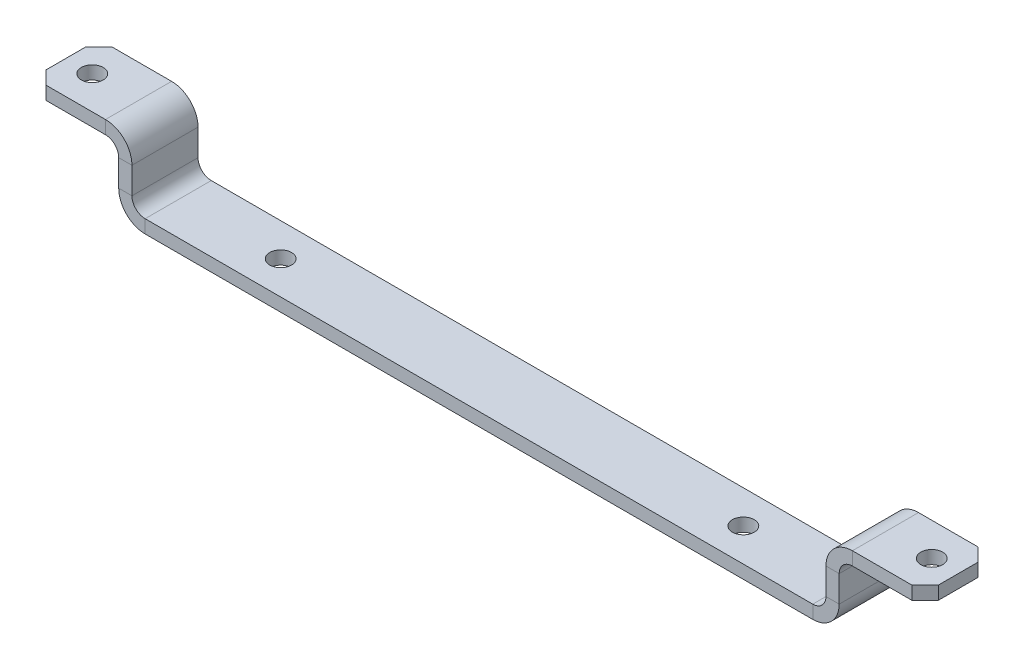
ISO-10303-21;
HEADER;
FILE_DESCRIPTION(('STEP AP214'),'2;1');
FILE_NAME('part.step','',(''),(''),'','','');
FILE_SCHEMA(('AUTOMOTIVE_DESIGN { 1 0 10303 214 1 1 1 1 }'));
ENDSEC;
DATA;
#1=APPLICATION_CONTEXT('core data for automotive mechanical design processes');
#2=APPLICATION_PROTOCOL_DEFINITION('international standard','automotive_design',2000,#1);
#3=PRODUCT_CONTEXT('',#1,'mechanical');
#4=PRODUCT('Part','Part','',(#3));
#5=PRODUCT_RELATED_PRODUCT_CATEGORY('part','',(#4));
#6=PRODUCT_DEFINITION_FORMATION('','',#4);
#7=PRODUCT_DEFINITION_CONTEXT('part definition',#1,'design');
#8=PRODUCT_DEFINITION('design','',#6,#7);
#9=PRODUCT_DEFINITION_SHAPE('','',#8);
#10=(LENGTH_UNIT() NAMED_UNIT(*) SI_UNIT(.MILLI.,.METRE.));
#11=(NAMED_UNIT(*) PLANE_ANGLE_UNIT() SI_UNIT($,.RADIAN.));
#12=(NAMED_UNIT(*) SI_UNIT($,.STERADIAN.) SOLID_ANGLE_UNIT());
#13=UNCERTAINTY_MEASURE_WITH_UNIT(LENGTH_MEASURE(1.E-05),#10,'distance_accuracy_value','');
#14=(GEOMETRIC_REPRESENTATION_CONTEXT(3) GLOBAL_UNCERTAINTY_ASSIGNED_CONTEXT((#13)) GLOBAL_UNIT_ASSIGNED_CONTEXT((#10,
#11,#12)) REPRESENTATION_CONTEXT('',''));
#15=CARTESIAN_POINT('',(0.,0.,0.));
#16=DIRECTION('',(0.,0.,1.));
#17=DIRECTION('',(1.,0.,0.));
#18=AXIS2_PLACEMENT_3D('',#15,#16,#17);
#19=CARTESIAN_POINT('',(-52.5,6.,5.));
#20=DIRECTION('',(0.,0.,1.));
#21=DIRECTION('',(1.,0.,0.));
#22=AXIS2_PLACEMENT_3D('',#19,#20,#21);
#23=PLANE('',#22);
#24=DIRECTION('',(-1.,0.,0.));
#25=VECTOR('',#24,1.);
#26=CARTESIAN_POINT('',(-52.5,6.,5.));
#27=LINE('',#26,#25);
#28=CARTESIAN_POINT('',(-52.5,6.,5.));
#29=VERTEX_POINT('',#28);
#30=CARTESIAN_POINT('',(-54.5,6.,5.));
#31=VERTEX_POINT('',#30);
#32=EDGE_CURVE('E403',#29,#31,#27,.T.);
#33=ORIENTED_EDGE('',*,*,#32,.F.);
#34=CARTESIAN_POINT('',(-56.5,6.,5.));
#35=DIRECTION('',(0.,0.,1.));
#36=DIRECTION('',(1.,0.,0.));
#37=AXIS2_PLACEMENT_3D('',#34,#35,#36);
#38=CIRCLE('',#37,4.);
#39=CARTESIAN_POINT('',(-56.5,10.,5.));
#40=VERTEX_POINT('',#39);
#41=EDGE_CURVE('E249',#40,#29,#38,.F.);
#42=ORIENTED_EDGE('',*,*,#41,.F.);
#43=DIRECTION('',(0.,1.,0.));
#44=VECTOR('',#43,1.);
#45=CARTESIAN_POINT('',(-56.5,8.,5.));
#46=LINE('',#45,#44);
#47=CARTESIAN_POINT('',(-56.5,8.,5.));
#48=VERTEX_POINT('',#47);
#49=EDGE_CURVE('E400',#48,#40,#46,.T.);
#50=ORIENTED_EDGE('',*,*,#49,.F.);
#51=CARTESIAN_POINT('',(-56.5,6.,5.));
#52=DIRECTION('',(0.,0.,1.));
#53=DIRECTION('',(1.,0.,0.));
#54=AXIS2_PLACEMENT_3D('',#51,#52,#53);
#55=CIRCLE('',#54,2.);
#56=EDGE_CURVE('E256',#48,#31,#55,.F.);
#57=ORIENTED_EDGE('',*,*,#56,.T.);
#58=EDGE_LOOP('',(#33,#42,#50,#57));
#59=FACE_BOUND('',#58,.T.);
#60=ADVANCED_FACE('F38',(#59),#23,.T.);
#61=CARTESIAN_POINT('',(-56.5,8.,5.));
#62=DIRECTION('',(0.,0.,1.));
#63=DIRECTION('',(1.,0.,0.));
#64=AXIS2_PLACEMENT_3D('',#61,#62,#63);
#65=PLANE('',#64);
#66=DIRECTION('',(0.,-1.,0.));
#67=VECTOR('',#66,1.);
#68=CARTESIAN_POINT('',(-52.5,10.,5.));
#69=LINE('',#68,#67);
#70=CARTESIAN_POINT('',(-52.5,2.,5.));
#71=VERTEX_POINT('',#70);
#72=EDGE_CURVE('E246',#29,#71,#69,.T.);
#73=ORIENTED_EDGE('',*,*,#72,.F.);
#74=ORIENTED_EDGE('',*,*,#32,.T.);
#75=DIRECTION('',(0.,1.,0.));
#76=VECTOR('',#75,1.);
#77=CARTESIAN_POINT('',(-54.5,10.,5.));
#78=LINE('',#77,#76);
#79=CARTESIAN_POINT('',(-54.5,2.,5.));
#80=VERTEX_POINT('',#79);
#81=EDGE_CURVE('E259',#31,#80,#78,.F.);
#82=ORIENTED_EDGE('',*,*,#81,.T.);
#83=DIRECTION('',(1.,0.,0.));
#84=VECTOR('',#83,1.);
#85=CARTESIAN_POINT('',(-54.5,2.,5.));
#86=LINE('',#85,#84);
#87=EDGE_CURVE('E391',#80,#71,#86,.T.);
#88=ORIENTED_EDGE('',*,*,#87,.T.);
#89=EDGE_LOOP('',(#73,#74,#82,#88));
#90=FACE_BOUND('',#89,.T.);
#91=ADVANCED_FACE('F573',(#90),#65,.T.);
#92=CARTESIAN_POINT('',(-56.5,10.,-5.));
#93=DIRECTION('',(0.,0.,-1.));
#94=DIRECTION('',(-1.,0.,0.));
#95=AXIS2_PLACEMENT_3D('',#92,#93,#94);
#96=PLANE('',#95);
#97=DIRECTION('',(0.,-1.,0.));
#98=VECTOR('',#97,1.);
#99=CARTESIAN_POINT('',(-56.5,10.,-5.));
#100=LINE('',#99,#98);
#101=CARTESIAN_POINT('',(-56.5,10.,-5.));
#102=VERTEX_POINT('',#101);
#103=CARTESIAN_POINT('',(-56.5,8.,-5.));
#104=VERTEX_POINT('',#103);
#105=EDGE_CURVE('E397',#102,#104,#100,.T.);
#106=ORIENTED_EDGE('',*,*,#105,.F.);
#107=CARTESIAN_POINT('',(-56.5,6.,-5.));
#108=DIRECTION('',(0.,0.,1.));
#109=DIRECTION('',(1.,0.,0.));
#110=AXIS2_PLACEMENT_3D('',#107,#108,#109);
#111=CIRCLE('',#110,4.);
#112=CARTESIAN_POINT('',(-52.5,6.,-5.));
#113=VERTEX_POINT('',#112);
#114=EDGE_CURVE('E298',#102,#113,#111,.F.);
#115=ORIENTED_EDGE('',*,*,#114,.T.);
#116=DIRECTION('',(1.,0.,0.));
#117=VECTOR('',#116,1.);
#118=CARTESIAN_POINT('',(-54.5,6.,-5.));
#119=LINE('',#118,#117);
#120=CARTESIAN_POINT('',(-54.5,6.,-5.));
#121=VERTEX_POINT('',#120);
#122=EDGE_CURVE('E395',#121,#113,#119,.T.);
#123=ORIENTED_EDGE('',*,*,#122,.F.);
#124=CARTESIAN_POINT('',(-56.5,6.,-5.));
#125=DIRECTION('',(0.,0.,1.));
#126=DIRECTION('',(1.,0.,0.));
#127=AXIS2_PLACEMENT_3D('',#124,#125,#126);
#128=CIRCLE('',#127,2.);
#129=EDGE_CURVE('E305',#104,#121,#128,.F.);
#130=ORIENTED_EDGE('',*,*,#129,.F.);
#131=EDGE_LOOP('',(#106,#115,#123,#130));
#132=FACE_BOUND('',#131,.T.);
#133=ADVANCED_FACE('F530',(#132),#96,.T.);
#134=CARTESIAN_POINT('',(-54.5,6.,-5.));
#135=DIRECTION('',(0.,0.,-1.));
#136=DIRECTION('',(-1.,0.,0.));
#137=AXIS2_PLACEMENT_3D('',#134,#135,#136);
#138=PLANE('',#137);
#139=DIRECTION('',(1.,0.,0.));
#140=VECTOR('',#139,1.);
#141=CARTESIAN_POINT('',(-67.5,8.,-5.));
#142=LINE('',#141,#140);
#143=CARTESIAN_POINT('',(-65.5,8.,-5.));
#144=VERTEX_POINT('',#143);
#145=EDGE_CURVE('E303',#144,#104,#142,.T.);
#146=ORIENTED_EDGE('',*,*,#145,.F.);
#147=DIRECTION('',(0.,1.,0.));
#148=VECTOR('',#147,1.);
#149=CARTESIAN_POINT('',(-65.5,6.,-5.));
#150=LINE('',#149,#148);
#151=CARTESIAN_POINT('',(-65.5,10.,-5.));
#152=VERTEX_POINT('',#151);
#153=EDGE_CURVE('E405',#144,#152,#150,.T.);
#154=ORIENTED_EDGE('',*,*,#153,.T.);
#155=DIRECTION('',(1.,0.,0.));
#156=VECTOR('',#155,1.);
#157=CARTESIAN_POINT('',(-67.5,10.,-5.));
#158=LINE('',#157,#156);
#159=EDGE_CURVE('E301',#152,#102,#158,.T.);
#160=ORIENTED_EDGE('',*,*,#159,.T.);
#161=ORIENTED_EDGE('',*,*,#105,.T.);
#162=EDGE_LOOP('',(#146,#154,#160,#161));
#163=FACE_BOUND('',#162,.T.);
#164=ADVANCED_FACE('F527',(#163),#138,.T.);
#165=CARTESIAN_POINT('',(-50.5,0.,5.));
#166=DIRECTION('',(0.,0.,1.));
#167=DIRECTION('',(1.,0.,0.));
#168=AXIS2_PLACEMENT_3D('',#165,#166,#167);
#169=PLANE('',#168);
#170=DIRECTION('',(0.,-1.,0.));
#171=VECTOR('',#170,1.);
#172=CARTESIAN_POINT('',(-50.5,0.,5.));
#173=LINE('',#172,#171);
#174=CARTESIAN_POINT('',(-50.5,0.,5.));
#175=VERTEX_POINT('',#174);
#176=CARTESIAN_POINT('',(-50.5,-2.,5.));
#177=VERTEX_POINT('',#176);
#178=EDGE_CURVE('E393',#175,#177,#173,.T.);
#179=ORIENTED_EDGE('',*,*,#178,.F.);
#180=CARTESIAN_POINT('',(-50.5,2.,5.));
#181=DIRECTION('',(0.,0.,-1.));
#182=DIRECTION('',(-1.,0.,0.));
#183=AXIS2_PLACEMENT_3D('',#180,#181,#182);
#184=CIRCLE('',#183,2.);
#185=EDGE_CURVE('E243',#71,#175,#184,.F.);
#186=ORIENTED_EDGE('',*,*,#185,.F.);
#187=ORIENTED_EDGE('',*,*,#87,.F.);
#188=CARTESIAN_POINT('',(-50.5,2.,5.));
#189=DIRECTION('',(0.,0.,1.));
#190=DIRECTION('',(1.,0.,0.));
#191=AXIS2_PLACEMENT_3D('',#188,#189,#190);
#192=CIRCLE('',#191,4.);
#193=EDGE_CURVE('E262',#80,#177,#192,.T.);
#194=ORIENTED_EDGE('',*,*,#193,.T.);
#195=EDGE_LOOP('',(#179,#186,#187,#194));
#196=FACE_BOUND('',#195,.T.);
#197=ADVANCED_FACE('F571',(#196),#169,.T.);
#198=CARTESIAN_POINT('',(-54.5,2.,5.));
#199=DIRECTION('',(0.,0.,1.));
#200=DIRECTION('',(1.,0.,0.));
#201=AXIS2_PLACEMENT_3D('',#198,#199,#200);
#202=PLANE('',#201);
#203=DIRECTION('',(1.,0.,0.));
#204=VECTOR('',#203,1.);
#205=CARTESIAN_POINT('',(-52.5,0.,5.));
#206=LINE('',#205,#204);
#207=CARTESIAN_POINT('',(50.5,0.,5.));
#208=VERTEX_POINT('',#207);
#209=EDGE_CURVE('E240',#175,#208,#206,.T.);
#210=ORIENTED_EDGE('',*,*,#209,.F.);
#211=ORIENTED_EDGE('',*,*,#178,.T.);
#212=DIRECTION('',(1.,0.,0.));
#213=VECTOR('',#212,1.);
#214=CARTESIAN_POINT('',(-52.5,-2.,5.));
#215=LINE('',#214,#213);
#216=CARTESIAN_POINT('',(50.5,-1.99999999999998,5.));
#217=VERTEX_POINT('',#216);
#218=EDGE_CURVE('E265',#177,#217,#215,.T.);
#219=ORIENTED_EDGE('',*,*,#218,.T.);
#220=DIRECTION('',(0.,1.,0.));
#221=VECTOR('',#220,1.);
#222=CARTESIAN_POINT('',(50.5,-1.99999999999998,5.));
#223=LINE('',#222,#221);
#224=EDGE_CURVE('E383',#217,#208,#223,.T.);
#225=ORIENTED_EDGE('',*,*,#224,.T.);
#226=EDGE_LOOP('',(#210,#211,#219,#225));
#227=FACE_BOUND('',#226,.T.);
#228=ADVANCED_FACE('F569',(#227),#202,.T.);
#229=CARTESIAN_POINT('',(-52.5,2.,-5.));
#230=DIRECTION('',(0.,0.,-1.));
#231=DIRECTION('',(-1.,0.,0.));
#232=AXIS2_PLACEMENT_3D('',#229,#230,#231);
#233=PLANE('',#232);
#234=DIRECTION('',(-1.,0.,0.));
#235=VECTOR('',#234,1.);
#236=CARTESIAN_POINT('',(-52.5,2.,-5.));
#237=LINE('',#236,#235);
#238=CARTESIAN_POINT('',(-52.5,2.,-5.));
#239=VERTEX_POINT('',#238);
#240=CARTESIAN_POINT('',(-54.5,2.,-5.));
#241=VERTEX_POINT('',#240);
#242=EDGE_CURVE('E389',#239,#241,#237,.T.);
#243=ORIENTED_EDGE('',*,*,#242,.F.);
#244=CARTESIAN_POINT('',(-50.5,2.,-5.));
#245=DIRECTION('',(0.,0.,-1.));
#246=DIRECTION('',(-1.,0.,0.));
#247=AXIS2_PLACEMENT_3D('',#244,#245,#246);
#248=CIRCLE('',#247,2.);
#249=CARTESIAN_POINT('',(-50.5,0.,-5.));
#250=VERTEX_POINT('',#249);
#251=EDGE_CURVE('E292',#239,#250,#248,.F.);
#252=ORIENTED_EDGE('',*,*,#251,.T.);
#253=DIRECTION('',(0.,1.,0.));
#254=VECTOR('',#253,1.);
#255=CARTESIAN_POINT('',(-50.5,-2.,-5.));
#256=LINE('',#255,#254);
#257=CARTESIAN_POINT('',(-50.5,-2.,-5.));
#258=VERTEX_POINT('',#257);
#259=EDGE_CURVE('E387',#258,#250,#256,.T.);
#260=ORIENTED_EDGE('',*,*,#259,.F.);
#261=CARTESIAN_POINT('',(-50.5,2.,-5.));
#262=DIRECTION('',(0.,0.,1.));
#263=DIRECTION('',(1.,0.,0.));
#264=AXIS2_PLACEMENT_3D('',#261,#262,#263);
#265=CIRCLE('',#264,4.);
#266=EDGE_CURVE('E311',#241,#258,#265,.T.);
#267=ORIENTED_EDGE('',*,*,#266,.F.);
#268=EDGE_LOOP('',(#243,#252,#260,#267));
#269=FACE_BOUND('',#268,.T.);
#270=ADVANCED_FACE('F540',(#269),#233,.T.);
#271=CARTESIAN_POINT('',(-50.5,-2.,-5.));
#272=DIRECTION('',(0.,0.,-1.));
#273=DIRECTION('',(-1.,0.,0.));
#274=AXIS2_PLACEMENT_3D('',#271,#272,#273);
#275=PLANE('',#274);
#276=DIRECTION('',(0.,-1.,0.));
#277=VECTOR('',#276,1.);
#278=CARTESIAN_POINT('',(-52.5,10.,-5.));
#279=LINE('',#278,#277);
#280=EDGE_CURVE('E295',#113,#239,#279,.T.);
#281=ORIENTED_EDGE('',*,*,#280,.T.);
#282=ORIENTED_EDGE('',*,*,#242,.T.);
#283=DIRECTION('',(0.,1.,0.));
#284=VECTOR('',#283,1.);
#285=CARTESIAN_POINT('',(-54.5,10.,-5.));
#286=LINE('',#285,#284);
#287=EDGE_CURVE('E308',#121,#241,#286,.F.);
#288=ORIENTED_EDGE('',*,*,#287,.F.);
#289=ORIENTED_EDGE('',*,*,#122,.T.);
#290=EDGE_LOOP('',(#281,#282,#288,#289));
#291=FACE_BOUND('',#290,.T.);
#292=ADVANCED_FACE('F536',(#291),#275,.T.);
#293=CARTESIAN_POINT('',(52.5,2.00000000000002,5.));
#294=DIRECTION('',(0.,0.,1.));
#295=DIRECTION('',(1.,0.,0.));
#296=AXIS2_PLACEMENT_3D('',#293,#294,#295);
#297=PLANE('',#296);
#298=DIRECTION('',(1.,0.,0.));
#299=VECTOR('',#298,1.);
#300=CARTESIAN_POINT('',(52.5,2.00000000000002,5.));
#301=LINE('',#300,#299);
#302=CARTESIAN_POINT('',(52.5,2.00000000000002,5.));
#303=VERTEX_POINT('',#302);
#304=CARTESIAN_POINT('',(54.5,2.00000000000002,5.));
#305=VERTEX_POINT('',#304);
#306=EDGE_CURVE('E385',#303,#305,#301,.T.);
#307=ORIENTED_EDGE('',*,*,#306,.F.);
#308=CARTESIAN_POINT('',(50.5,2.00000000000002,5.));
#309=DIRECTION('',(0.,0.,-1.));
#310=DIRECTION('',(-1.,0.,0.));
#311=AXIS2_PLACEMENT_3D('',#308,#309,#310);
#312=CIRCLE('',#311,2.);
#313=EDGE_CURVE('E234',#208,#303,#312,.F.);
#314=ORIENTED_EDGE('',*,*,#313,.F.);
#315=ORIENTED_EDGE('',*,*,#224,.F.);
#316=CARTESIAN_POINT('',(50.5,2.00000000000002,5.));
#317=DIRECTION('',(0.,0.,1.));
#318=DIRECTION('',(1.,0.,0.));
#319=AXIS2_PLACEMENT_3D('',#316,#317,#318);
#320=CIRCLE('',#319,4.);
#321=EDGE_CURVE('E268',#217,#305,#320,.T.);
#322=ORIENTED_EDGE('',*,*,#321,.T.);
#323=EDGE_LOOP('',(#307,#314,#315,#322));
#324=FACE_BOUND('',#323,.T.);
#325=ADVANCED_FACE('F945',(#324),#297,.T.);
#326=CARTESIAN_POINT('',(50.5,-1.99999999999998,5.));
#327=DIRECTION('',(0.,0.,1.));
#328=DIRECTION('',(1.,0.,0.));
#329=AXIS2_PLACEMENT_3D('',#326,#327,#328);
#330=PLANE('',#329);
#331=DIRECTION('',(0.,1.,0.));
#332=VECTOR('',#331,1.);
#333=CARTESIAN_POINT('',(52.5,0.,5.));
#334=LINE('',#333,#332);
#335=CARTESIAN_POINT('',(52.5,6.00000000000002,5.));
#336=VERTEX_POINT('',#335);
#337=EDGE_CURVE('E232',#303,#336,#334,.T.);
#338=ORIENTED_EDGE('',*,*,#337,.F.);
#339=ORIENTED_EDGE('',*,*,#306,.T.);
#340=DIRECTION('',(0.,1.,0.));
#341=VECTOR('',#340,1.);
#342=CARTESIAN_POINT('',(54.5,0.,5.));
#343=LINE('',#342,#341);
#344=CARTESIAN_POINT('',(54.5,6.00000000000002,5.));
#345=VERTEX_POINT('',#344);
#346=EDGE_CURVE('E271',#305,#345,#343,.T.);
#347=ORIENTED_EDGE('',*,*,#346,.T.);
#348=DIRECTION('',(-1.,0.,0.));
#349=VECTOR('',#348,1.);
#350=CARTESIAN_POINT('',(54.5,6.00000000000002,5.));
#351=LINE('',#350,#349);
#352=EDGE_CURVE('E209',#345,#336,#351,.T.);
#353=ORIENTED_EDGE('',*,*,#352,.T.);
#354=EDGE_LOOP('',(#338,#339,#347,#353));
#355=FACE_BOUND('',#354,.T.);
#356=ADVANCED_FACE('F934',(#355),#330,.T.);
#357=CARTESIAN_POINT('',(50.5,0.,-5.));
#358=DIRECTION('',(0.,0.,-1.));
#359=DIRECTION('',(-1.,0.,0.));
#360=AXIS2_PLACEMENT_3D('',#357,#358,#359);
#361=PLANE('',#360);
#362=DIRECTION('',(0.,-1.,0.));
#363=VECTOR('',#362,1.);
#364=CARTESIAN_POINT('',(50.5,0.,-5.));
#365=LINE('',#364,#363);
#366=CARTESIAN_POINT('',(50.5,0.,-5.));
#367=VERTEX_POINT('',#366);
#368=CARTESIAN_POINT('',(50.5,-1.99999999999998,-5.));
#369=VERTEX_POINT('',#368);
#370=EDGE_CURVE('E381',#367,#369,#365,.T.);
#371=ORIENTED_EDGE('',*,*,#370,.F.);
#372=CARTESIAN_POINT('',(50.5,2.00000000000002,-5.));
#373=DIRECTION('',(0.,0.,-1.));
#374=DIRECTION('',(-1.,0.,0.));
#375=AXIS2_PLACEMENT_3D('',#372,#373,#374);
#376=CIRCLE('',#375,2.);
#377=CARTESIAN_POINT('',(52.5,2.00000000000002,-5.));
#378=VERTEX_POINT('',#377);
#379=EDGE_CURVE('E286',#367,#378,#376,.F.);
#380=ORIENTED_EDGE('',*,*,#379,.T.);
#381=DIRECTION('',(-1.,0.,0.));
#382=VECTOR('',#381,1.);
#383=CARTESIAN_POINT('',(54.5,2.00000000000002,-5.));
#384=LINE('',#383,#382);
#385=CARTESIAN_POINT('',(54.5,2.00000000000002,-5.));
#386=VERTEX_POINT('',#385);
#387=EDGE_CURVE('E208',#386,#378,#384,.T.);
#388=ORIENTED_EDGE('',*,*,#387,.F.);
#389=CARTESIAN_POINT('',(50.5,2.00000000000002,-5.));
#390=DIRECTION('',(0.,0.,1.));
#391=DIRECTION('',(1.,0.,0.));
#392=AXIS2_PLACEMENT_3D('',#389,#390,#391);
#393=CIRCLE('',#392,4.);
#394=EDGE_CURVE('E317',#369,#386,#393,.T.);
#395=ORIENTED_EDGE('',*,*,#394,.F.);
#396=EDGE_LOOP('',(#371,#380,#388,#395));
#397=FACE_BOUND('',#396,.T.);
#398=ADVANCED_FACE('F924',(#397),#361,.T.);
#399=CARTESIAN_POINT('',(54.5,2.00000000000002,-5.));
#400=DIRECTION('',(0.,0.,-1.));
#401=DIRECTION('',(-1.,0.,0.));
#402=AXIS2_PLACEMENT_3D('',#399,#400,#401);
#403=PLANE('',#402);
#404=DIRECTION('',(1.,0.,0.));
#405=VECTOR('',#404,1.);
#406=CARTESIAN_POINT('',(-52.5,0.,-5.));
#407=LINE('',#406,#405);
#408=EDGE_CURVE('E289',#250,#367,#407,.T.);
#409=ORIENTED_EDGE('',*,*,#408,.T.);
#410=ORIENTED_EDGE('',*,*,#370,.T.);
#411=DIRECTION('',(1.,0.,0.));
#412=VECTOR('',#411,1.);
#413=CARTESIAN_POINT('',(-52.5,-2.,-5.));
#414=LINE('',#413,#412);
#415=EDGE_CURVE('E314',#258,#369,#414,.T.);
#416=ORIENTED_EDGE('',*,*,#415,.F.);
#417=ORIENTED_EDGE('',*,*,#259,.T.);
#418=EDGE_LOOP('',(#409,#410,#416,#417));
#419=FACE_BOUND('',#418,.T.);
#420=ADVANCED_FACE('F557',(#419),#403,.T.);
#421=CARTESIAN_POINT('',(56.5,10.,5.));
#422=DIRECTION('',(0.,0.,1.));
#423=DIRECTION('',(1.,0.,0.));
#424=AXIS2_PLACEMENT_3D('',#421,#422,#423);
#425=PLANE('',#424);
#426=DIRECTION('',(0.,-1.,0.));
#427=VECTOR('',#426,1.);
#428=CARTESIAN_POINT('',(56.5,10.,5.));
#429=LINE('',#428,#427);
#430=CARTESIAN_POINT('',(56.5,10.,5.));
#431=VERTEX_POINT('',#430);
#432=CARTESIAN_POINT('',(56.5,8.00000000000002,5.));
#433=VERTEX_POINT('',#432);
#434=EDGE_CURVE('E199',#431,#433,#429,.T.);
#435=ORIENTED_EDGE('',*,*,#434,.F.);
#436=CARTESIAN_POINT('',(56.5,6.00000000000002,5.));
#437=DIRECTION('',(0.,0.,1.));
#438=DIRECTION('',(1.,0.,0.));
#439=AXIS2_PLACEMENT_3D('',#436,#437,#438);
#440=CIRCLE('',#439,4.);
#441=EDGE_CURVE('E203',#336,#431,#440,.F.);
#442=ORIENTED_EDGE('',*,*,#441,.F.);
#443=ORIENTED_EDGE('',*,*,#352,.F.);
#444=CARTESIAN_POINT('',(56.5,6.00000000000002,5.));
#445=DIRECTION('',(0.,0.,1.));
#446=DIRECTION('',(1.,0.,0.));
#447=AXIS2_PLACEMENT_3D('',#444,#445,#446);
#448=CIRCLE('',#447,2.);
#449=EDGE_CURVE('E206',#345,#433,#448,.F.);
#450=ORIENTED_EDGE('',*,*,#449,.T.);
#451=EDGE_LOOP('',(#435,#442,#443,#450));
#452=FACE_BOUND('',#451,.T.);
#453=ADVANCED_FACE('F201',(#452),#425,.T.);
#454=CARTESIAN_POINT('',(54.5,6.00000000000002,5.));
#455=DIRECTION('',(0.,0.,1.));
#456=DIRECTION('',(1.,0.,0.));
#457=AXIS2_PLACEMENT_3D('',#454,#455,#456);
#458=PLANE('',#457);
#459=DIRECTION('',(1.,0.,0.));
#460=VECTOR('',#459,1.);
#461=CARTESIAN_POINT('',(52.5,8.00000000000002,5.));
#462=LINE('',#461,#460);
#463=CARTESIAN_POINT('',(65.5,8.00000000000002,5.));
#464=VERTEX_POINT('',#463);
#465=EDGE_CURVE('E227',#433,#464,#462,.T.);
#466=ORIENTED_EDGE('',*,*,#465,.T.);
#467=DIRECTION('',(0.,1.,0.));
#468=VECTOR('',#467,1.);
#469=CARTESIAN_POINT('',(65.5,6.00000000000002,5.));
#470=LINE('',#469,#468);
#471=CARTESIAN_POINT('',(65.5,10.,5.));
#472=VERTEX_POINT('',#471);
#473=EDGE_CURVE('E46',#464,#472,#470,.T.);
#474=ORIENTED_EDGE('',*,*,#473,.T.);
#475=DIRECTION('',(1.,0.,0.));
#476=VECTOR('',#475,1.);
#477=CARTESIAN_POINT('',(52.5,10.,5.));
#478=LINE('',#477,#476);
#479=EDGE_CURVE('E216',#431,#472,#478,.T.);
#480=ORIENTED_EDGE('',*,*,#479,.F.);
#481=ORIENTED_EDGE('',*,*,#434,.T.);
#482=EDGE_LOOP('',(#466,#474,#480,#481));
#483=FACE_BOUND('',#482,.T.);
#484=ADVANCED_FACE('F226',(#483),#458,.T.);
#485=CARTESIAN_POINT('',(52.5,6.00000000000002,-5.));
#486=DIRECTION('',(0.,0.,-1.));
#487=DIRECTION('',(-1.,0.,0.));
#488=AXIS2_PLACEMENT_3D('',#485,#486,#487);
#489=PLANE('',#488);
#490=DIRECTION('',(1.,0.,0.));
#491=VECTOR('',#490,1.);
#492=CARTESIAN_POINT('',(52.5,6.00000000000002,-5.));
#493=LINE('',#492,#491);
#494=CARTESIAN_POINT('',(52.5,6.00000000000002,-5.));
#495=VERTEX_POINT('',#494);
#496=CARTESIAN_POINT('',(54.5,6.00000000000002,-5.));
#497=VERTEX_POINT('',#496);
#498=EDGE_CURVE('E377',#495,#497,#493,.T.);
#499=ORIENTED_EDGE('',*,*,#498,.F.);
#500=CARTESIAN_POINT('',(56.5,6.00000000000002,-5.));
#501=DIRECTION('',(0.,0.,1.));
#502=DIRECTION('',(1.,0.,0.));
#503=AXIS2_PLACEMENT_3D('',#500,#501,#502);
#504=CIRCLE('',#503,4.);
#505=CARTESIAN_POINT('',(56.5,10.,-5.));
#506=VERTEX_POINT('',#505);
#507=EDGE_CURVE('E281',#495,#506,#504,.F.);
#508=ORIENTED_EDGE('',*,*,#507,.T.);
#509=DIRECTION('',(0.,1.,0.));
#510=VECTOR('',#509,1.);
#511=CARTESIAN_POINT('',(56.5,8.00000000000002,-5.));
#512=LINE('',#511,#510);
#513=CARTESIAN_POINT('',(56.5,8.00000000000002,-5.));
#514=VERTEX_POINT('',#513);
#515=EDGE_CURVE('E375',#514,#506,#512,.T.);
#516=ORIENTED_EDGE('',*,*,#515,.F.);
#517=CARTESIAN_POINT('',(56.5,6.00000000000002,-5.));
#518=DIRECTION('',(0.,0.,1.));
#519=DIRECTION('',(1.,0.,0.));
#520=AXIS2_PLACEMENT_3D('',#517,#518,#519);
#521=CIRCLE('',#520,2.);
#522=EDGE_CURVE('E323',#497,#514,#521,.F.);
#523=ORIENTED_EDGE('',*,*,#522,.F.);
#524=EDGE_LOOP('',(#499,#508,#516,#523));
#525=FACE_BOUND('',#524,.T.);
#526=ADVANCED_FACE('F460',(#525),#489,.T.);
#527=CARTESIAN_POINT('',(56.5,8.00000000000002,-5.));
#528=DIRECTION('',(0.,0.,-1.));
#529=DIRECTION('',(-1.,0.,0.));
#530=AXIS2_PLACEMENT_3D('',#527,#528,#529);
#531=PLANE('',#530);
#532=DIRECTION('',(0.,1.,0.));
#533=VECTOR('',#532,1.);
#534=CARTESIAN_POINT('',(52.5,0.,-5.));
#535=LINE('',#534,#533);
#536=EDGE_CURVE('E283',#378,#495,#535,.T.);
#537=ORIENTED_EDGE('',*,*,#536,.T.);
#538=ORIENTED_EDGE('',*,*,#498,.T.);
#539=DIRECTION('',(0.,1.,0.));
#540=VECTOR('',#539,1.);
#541=CARTESIAN_POINT('',(54.5,0.,-5.));
#542=LINE('',#541,#540);
#543=EDGE_CURVE('E320',#386,#497,#542,.T.);
#544=ORIENTED_EDGE('',*,*,#543,.F.);
#545=ORIENTED_EDGE('',*,*,#387,.T.);
#546=EDGE_LOOP('',(#537,#538,#544,#545));
#547=FACE_BOUND('',#546,.T.);
#548=ADVANCED_FACE('F700',(#547),#531,.T.);
#549=CARTESIAN_POINT('',(52.5,8.00000000000002,5.));
#550=DIRECTION('',(0.,1.,0.));
#551=DIRECTION('',(-1.,0.,0.));
#552=AXIS2_PLACEMENT_3D('',#549,#550,#551);
#553=PLANE('',#552);
#554=CARTESIAN_POINT('',(63.5,8.00000000000002,0.));
#555=DIRECTION('',(0.,1.,0.));
#556=DIRECTION('',(-1.,0.,0.));
#557=AXIS2_PLACEMENT_3D('',#554,#555,#556);
#558=CIRCLE('',#557,1.64999999999999);
#559=CARTESIAN_POINT('',(61.85,8.00000000000002,0.));
#560=VERTEX_POINT('',#559);
#561=EDGE_CURVE('E476',#560,#560,#558,.T.);
#562=ORIENTED_EDGE('',*,*,#561,.T.);
#563=EDGE_LOOP('',(#562));
#564=FACE_BOUND('',#563,.T.);
#565=DIRECTION('',(0.,0.,-1.));
#566=VECTOR('',#565,1.);
#567=CARTESIAN_POINT('',(67.5,8.00000000000002,5.));
#568=LINE('',#567,#566);
#569=CARTESIAN_POINT('',(67.5,8.00000000000002,3.));
#570=VERTEX_POINT('',#569);
#571=CARTESIAN_POINT('',(67.5,8.00000000000002,-3.));
#572=VERTEX_POINT('',#571);
#573=EDGE_CURVE('E373',#570,#572,#568,.T.);
#574=ORIENTED_EDGE('',*,*,#573,.F.);
#575=DIRECTION('',(0.707106781186548,0.,-0.707106781186547));
#576=VECTOR('',#575,1.);
#577=CARTESIAN_POINT('',(67.5,8.00000000000002,3.));
#578=LINE('',#577,#576);
#579=EDGE_CURVE('E60',#570,#464,#578,.F.);
#580=ORIENTED_EDGE('',*,*,#579,.T.);
#581=ORIENTED_EDGE('',*,*,#465,.F.);
#582=DIRECTION('',(0.,0.,-1.));
#583=VECTOR('',#582,1.);
#584=CARTESIAN_POINT('',(56.5,8.00000000000002,5.));
#585=LINE('',#584,#583);
#586=EDGE_CURVE('E275',#433,#514,#585,.T.);
#587=ORIENTED_EDGE('',*,*,#586,.T.);
#588=DIRECTION('',(1.,0.,0.));
#589=VECTOR('',#588,1.);
#590=CARTESIAN_POINT('',(52.5,8.00000000000002,-5.));
#591=LINE('',#590,#589);
#592=CARTESIAN_POINT('',(65.5,8.00000000000002,-5.));
#593=VERTEX_POINT('',#592);
#594=EDGE_CURVE('E276',#514,#593,#591,.T.);
#595=ORIENTED_EDGE('',*,*,#594,.T.);
#596=DIRECTION('',(0.707106781186548,0.,0.707106781186547));
#597=VECTOR('',#596,1.);
#598=CARTESIAN_POINT('',(65.5,8.00000000000002,-5.));
#599=LINE('',#598,#597);
#600=EDGE_CURVE('E433',#593,#572,#599,.T.);
#601=ORIENTED_EDGE('',*,*,#600,.T.);
#602=EDGE_LOOP('',(#574,#580,#581,#587,#595,#601));
#603=FACE_BOUND('',#602,.T.);
#604=ADVANCED_FACE('F449',(#564,#603),#553,.F.);
#605=CARTESIAN_POINT('',(67.5,10.,5.));
#606=DIRECTION('',(1.,0.,0.));
#607=DIRECTION('',(0.,0.,-1.));
#608=AXIS2_PLACEMENT_3D('',#605,#606,#607);
#609=PLANE('',#608);
#610=DIRECTION('',(0.,0.,-1.));
#611=VECTOR('',#610,1.);
#612=CARTESIAN_POINT('',(67.5,10.,5.));
#613=LINE('',#612,#611);
#614=CARTESIAN_POINT('',(67.5,10.,3.));
#615=VERTEX_POINT('',#614);
#616=CARTESIAN_POINT('',(67.5,10.,-3.));
#617=VERTEX_POINT('',#616);
#618=EDGE_CURVE('E223',#615,#617,#613,.T.);
#619=ORIENTED_EDGE('',*,*,#618,.F.);
#620=DIRECTION('',(0.,-1.,0.));
#621=VECTOR('',#620,1.);
#622=CARTESIAN_POINT('',(67.5,10.,3.));
#623=LINE('',#622,#621);
#624=EDGE_CURVE('E441',#615,#570,#623,.T.);
#625=ORIENTED_EDGE('',*,*,#624,.T.);
#626=ORIENTED_EDGE('',*,*,#573,.T.);
#627=DIRECTION('',(0.,1.,0.));
#628=VECTOR('',#627,1.);
#629=CARTESIAN_POINT('',(67.5,10.,-3.));
#630=LINE('',#629,#628);
#631=EDGE_CURVE('E436',#572,#617,#630,.T.);
#632=ORIENTED_EDGE('',*,*,#631,.T.);
#633=EDGE_LOOP('',(#619,#625,#626,#632));
#634=FACE_BOUND('',#633,.T.);
#635=ADVANCED_FACE('F447',(#634),#609,.T.);
#636=CARTESIAN_POINT('',(52.5,10.,5.));
#637=DIRECTION('',(0.,1.,0.));
#638=DIRECTION('',(-1.,0.,0.));
#639=AXIS2_PLACEMENT_3D('',#636,#637,#638);
#640=PLANE('',#639);
#641=CARTESIAN_POINT('',(63.5,10.,0.));
#642=DIRECTION('',(0.,1.,0.));
#643=DIRECTION('',(0.,0.,1.));
#644=AXIS2_PLACEMENT_3D('',#641,#642,#643);
#645=CIRCLE('',#644,1.64999999999998);
#646=CARTESIAN_POINT('',(63.5,10.,1.64999999999998));
#647=VERTEX_POINT('',#646);
#648=EDGE_CURVE('E409',#647,#647,#645,.T.);
#649=ORIENTED_EDGE('',*,*,#648,.F.);
#650=EDGE_LOOP('',(#649));
#651=FACE_BOUND('',#650,.T.);
#652=ORIENTED_EDGE('',*,*,#479,.T.);
#653=DIRECTION('',(-0.707106781186548,0.,0.707106781186547));
#654=VECTOR('',#653,1.);
#655=CARTESIAN_POINT('',(59.,10.,11.5));
#656=LINE('',#655,#654);
#657=EDGE_CURVE('E11',#472,#615,#656,.F.);
#658=ORIENTED_EDGE('',*,*,#657,.T.);
#659=ORIENTED_EDGE('',*,*,#618,.T.);
#660=DIRECTION('',(-0.707106781186548,0.,-0.707106781186547));
#661=VECTOR('',#660,1.);
#662=CARTESIAN_POINT('',(64.,10.,-6.50000000000001));
#663=LINE('',#662,#661);
#664=CARTESIAN_POINT('',(65.5,10.,-5.));
#665=VERTEX_POINT('',#664);
#666=EDGE_CURVE('E439',#617,#665,#663,.T.);
#667=ORIENTED_EDGE('',*,*,#666,.T.);
#668=DIRECTION('',(1.,0.,0.));
#669=VECTOR('',#668,1.);
#670=CARTESIAN_POINT('',(52.5,10.,-5.));
#671=LINE('',#670,#669);
#672=EDGE_CURVE('E219',#506,#665,#671,.T.);
#673=ORIENTED_EDGE('',*,*,#672,.F.);
#674=DIRECTION('',(0.,0.,-1.));
#675=VECTOR('',#674,1.);
#676=CARTESIAN_POINT('',(56.5,10.,5.));
#677=LINE('',#676,#675);
#678=EDGE_CURVE('E214',#431,#506,#677,.T.);
#679=ORIENTED_EDGE('',*,*,#678,.F.);
#680=EDGE_LOOP('',(#652,#658,#659,#667,#673,#679));
#681=FACE_BOUND('',#680,.T.);
#682=ADVANCED_FACE('F215',(#651,#681),#640,.T.);
#683=CARTESIAN_POINT('',(56.5,6.00000000000002,5.));
#684=DIRECTION('',(0.,0.,-1.));
#685=DIRECTION('',(-1.,0.,0.));
#686=AXIS2_PLACEMENT_3D('',#683,#684,#685);
#687=CYLINDRICAL_SURFACE('',#686,4.);
#688=ORIENTED_EDGE('',*,*,#507,.F.);
#689=DIRECTION('',(0.,0.,-1.));
#690=VECTOR('',#689,1.);
#691=CARTESIAN_POINT('',(52.5,6.00000000000002,5.));
#692=LINE('',#691,#690);
#693=EDGE_CURVE('E224',#336,#495,#692,.T.);
#694=ORIENTED_EDGE('',*,*,#693,.F.);
#695=ORIENTED_EDGE('',*,*,#441,.T.);
#696=ORIENTED_EDGE('',*,*,#678,.T.);
#697=EDGE_LOOP('',(#688,#694,#695,#696));
#698=FACE_BOUND('',#697,.T.);
#699=ADVANCED_FACE('F230',(#698),#687,.T.);
#700=CARTESIAN_POINT('',(52.5,0.,5.));
#701=DIRECTION('',(-1.,0.,0.));
#702=DIRECTION('',(0.,0.,1.));
#703=AXIS2_PLACEMENT_3D('',#700,#701,#702);
#704=PLANE('',#703);
#705=ORIENTED_EDGE('',*,*,#536,.F.);
#706=DIRECTION('',(0.,0.,-1.));
#707=VECTOR('',#706,1.);
#708=CARTESIAN_POINT('',(52.5,2.00000000000002,5.));
#709=LINE('',#708,#707);
#710=EDGE_CURVE('E368',#303,#378,#709,.T.);
#711=ORIENTED_EDGE('',*,*,#710,.F.);
#712=ORIENTED_EDGE('',*,*,#337,.T.);
#713=ORIENTED_EDGE('',*,*,#693,.T.);
#714=EDGE_LOOP('',(#705,#711,#712,#713));
#715=FACE_BOUND('',#714,.T.);
#716=ADVANCED_FACE('F874',(#715),#704,.T.);
#717=CARTESIAN_POINT('',(50.5,2.00000000000002,5.));
#718=DIRECTION('',(0.,0.,-1.));
#719=DIRECTION('',(-1.,0.,0.));
#720=AXIS2_PLACEMENT_3D('',#717,#718,#719);
#721=CYLINDRICAL_SURFACE('',#720,2.);
#722=ORIENTED_EDGE('',*,*,#379,.F.);
#723=DIRECTION('',(0.,0.,-1.));
#724=VECTOR('',#723,1.);
#725=CARTESIAN_POINT('',(50.5,0.,5.));
#726=LINE('',#725,#724);
#727=EDGE_CURVE('E365',#208,#367,#726,.T.);
#728=ORIENTED_EDGE('',*,*,#727,.F.);
#729=ORIENTED_EDGE('',*,*,#313,.T.);
#730=ORIENTED_EDGE('',*,*,#710,.T.);
#731=EDGE_LOOP('',(#722,#728,#729,#730));
#732=FACE_BOUND('',#731,.T.);
#733=ADVANCED_FACE('F789',(#732),#721,.F.);
#734=CARTESIAN_POINT('',(-52.5,0.,5.));
#735=DIRECTION('',(0.,1.,0.));
#736=DIRECTION('',(-1.,0.,0.));
#737=AXIS2_PLACEMENT_3D('',#734,#735,#736);
#738=PLANE('',#737);
#739=CARTESIAN_POINT('',(-35.,0.,0.));
#740=DIRECTION('',(0.,1.,0.));
#741=DIRECTION('',(-1.,0.,0.));
#742=AXIS2_PLACEMENT_3D('',#739,#740,#741);
#743=CIRCLE('',#742,1.64999999999999);
#744=CARTESIAN_POINT('',(-36.65,0.,0.));
#745=VERTEX_POINT('',#744);
#746=EDGE_CURVE('E470',#745,#745,#743,.T.);
#747=ORIENTED_EDGE('',*,*,#746,.F.);
#748=EDGE_LOOP('',(#747));
#749=FACE_BOUND('',#748,.T.);
#750=CARTESIAN_POINT('',(35.,0.,0.));
#751=DIRECTION('',(0.,1.,0.));
#752=DIRECTION('',(-1.,0.,0.));
#753=AXIS2_PLACEMENT_3D('',#750,#751,#752);
#754=CIRCLE('',#753,1.64999999999999);
#755=CARTESIAN_POINT('',(33.35,0.,0.));
#756=VERTEX_POINT('',#755);
#757=EDGE_CURVE('E279',#756,#756,#754,.T.);
#758=ORIENTED_EDGE('',*,*,#757,.F.);
#759=EDGE_LOOP('',(#758));
#760=FACE_BOUND('',#759,.T.);
#761=ORIENTED_EDGE('',*,*,#408,.F.);
#762=DIRECTION('',(0.,0.,-1.));
#763=VECTOR('',#762,1.);
#764=CARTESIAN_POINT('',(-50.5,0.,5.));
#765=LINE('',#764,#763);
#766=EDGE_CURVE('E362',#175,#250,#765,.T.);
#767=ORIENTED_EDGE('',*,*,#766,.F.);
#768=ORIENTED_EDGE('',*,*,#209,.T.);
#769=ORIENTED_EDGE('',*,*,#727,.T.);
#770=EDGE_LOOP('',(#761,#767,#768,#769));
#771=FACE_BOUND('',#770,.T.);
#772=ADVANCED_FACE('F553',(#749,#760,#771),#738,.T.);
#773=CARTESIAN_POINT('',(-50.5,2.,5.));
#774=DIRECTION('',(0.,0.,-1.));
#775=DIRECTION('',(-1.,0.,0.));
#776=AXIS2_PLACEMENT_3D('',#773,#774,#775);
#777=CYLINDRICAL_SURFACE('',#776,2.);
#778=ORIENTED_EDGE('',*,*,#251,.F.);
#779=DIRECTION('',(0.,0.,-1.));
#780=VECTOR('',#779,1.);
#781=CARTESIAN_POINT('',(-52.5,2.,5.));
#782=LINE('',#781,#780);
#783=EDGE_CURVE('E359',#71,#239,#782,.T.);
#784=ORIENTED_EDGE('',*,*,#783,.F.);
#785=ORIENTED_EDGE('',*,*,#185,.T.);
#786=ORIENTED_EDGE('',*,*,#766,.T.);
#787=EDGE_LOOP('',(#778,#784,#785,#786));
#788=FACE_BOUND('',#787,.T.);
#789=ADVANCED_FACE('F548',(#788),#777,.F.);
#790=CARTESIAN_POINT('',(-52.5,10.,5.));
#791=DIRECTION('',(1.,0.,0.));
#792=DIRECTION('',(0.,0.,-1.));
#793=AXIS2_PLACEMENT_3D('',#790,#791,#792);
#794=PLANE('',#793);
#795=ORIENTED_EDGE('',*,*,#280,.F.);
#796=DIRECTION('',(0.,0.,-1.));
#797=VECTOR('',#796,1.);
#798=CARTESIAN_POINT('',(-52.5,6.,5.));
#799=LINE('',#798,#797);
#800=EDGE_CURVE('E356',#29,#113,#799,.T.);
#801=ORIENTED_EDGE('',*,*,#800,.F.);
#802=ORIENTED_EDGE('',*,*,#72,.T.);
#803=ORIENTED_EDGE('',*,*,#783,.T.);
#804=EDGE_LOOP('',(#795,#801,#802,#803));
#805=FACE_BOUND('',#804,.T.);
#806=ADVANCED_FACE('F544',(#805),#794,.T.);
#807=CARTESIAN_POINT('',(-56.5,6.,5.));
#808=DIRECTION('',(0.,0.,-1.));
#809=DIRECTION('',(-1.,0.,0.));
#810=AXIS2_PLACEMENT_3D('',#807,#808,#809);
#811=CYLINDRICAL_SURFACE('',#810,4.);
#812=ORIENTED_EDGE('',*,*,#114,.F.);
#813=DIRECTION('',(0.,0.,-1.));
#814=VECTOR('',#813,1.);
#815=CARTESIAN_POINT('',(-56.5,10.,5.));
#816=LINE('',#815,#814);
#817=EDGE_CURVE('E353',#40,#102,#816,.T.);
#818=ORIENTED_EDGE('',*,*,#817,.F.);
#819=ORIENTED_EDGE('',*,*,#41,.T.);
#820=ORIENTED_EDGE('',*,*,#800,.T.);
#821=EDGE_LOOP('',(#812,#818,#819,#820));
#822=FACE_BOUND('',#821,.T.);
#823=ADVANCED_FACE('F491',(#822),#811,.T.);
#824=CARTESIAN_POINT('',(-67.5,10.,5.));
#825=DIRECTION('',(0.,1.,0.));
#826=DIRECTION('',(0.,0.,1.));
#827=AXIS2_PLACEMENT_3D('',#824,#825,#826);
#828=PLANE('',#827);
#829=CARTESIAN_POINT('',(-63.5,10.,0.));
#830=DIRECTION('',(0.,1.,0.));
#831=DIRECTION('',(0.,0.,1.));
#832=AXIS2_PLACEMENT_3D('',#829,#830,#831);
#833=CIRCLE('',#832,1.64999999999998);
#834=CARTESIAN_POINT('',(-63.5,10.,1.64999999999998));
#835=VERTEX_POINT('',#834);
#836=EDGE_CURVE('E410',#835,#835,#833,.T.);
#837=ORIENTED_EDGE('',*,*,#836,.F.);
#838=EDGE_LOOP('',(#837));
#839=FACE_BOUND('',#838,.T.);
#840=DIRECTION('',(0.,0.,-1.));
#841=VECTOR('',#840,1.);
#842=CARTESIAN_POINT('',(-67.5,10.,5.));
#843=LINE('',#842,#841);
#844=CARTESIAN_POINT('',(-67.5,10.,3.));
#845=VERTEX_POINT('',#844);
#846=CARTESIAN_POINT('',(-67.5,10.,-3.));
#847=VERTEX_POINT('',#846);
#848=EDGE_CURVE('E351',#845,#847,#843,.T.);
#849=ORIENTED_EDGE('',*,*,#848,.F.);
#850=DIRECTION('',(-0.707106781186548,0.,-0.707106781186547));
#851=VECTOR('',#850,1.);
#852=CARTESIAN_POINT('',(-66.5,10.,4.));
#853=LINE('',#852,#851);
#854=CARTESIAN_POINT('',(-65.5,10.,5.));
#855=VERTEX_POINT('',#854);
#856=EDGE_CURVE('E424',#845,#855,#853,.F.);
#857=ORIENTED_EDGE('',*,*,#856,.T.);
#858=DIRECTION('',(1.,0.,0.));
#859=VECTOR('',#858,1.);
#860=CARTESIAN_POINT('',(-67.5,10.,5.));
#861=LINE('',#860,#859);
#862=EDGE_CURVE('E252',#855,#40,#861,.T.);
#863=ORIENTED_EDGE('',*,*,#862,.T.);
#864=ORIENTED_EDGE('',*,*,#817,.T.);
#865=ORIENTED_EDGE('',*,*,#159,.F.);
#866=DIRECTION('',(0.707106781186548,0.,-0.707106781186547));
#867=VECTOR('',#866,1.);
#868=CARTESIAN_POINT('',(-71.5,10.,0.999999999999997));
#869=LINE('',#868,#867);
#870=EDGE_CURVE('E413',#152,#847,#869,.F.);
#871=ORIENTED_EDGE('',*,*,#870,.T.);
#872=EDGE_LOOP('',(#849,#857,#863,#864,#865,#871));
#873=FACE_BOUND('',#872,.T.);
#874=ADVANCED_FACE('F487',(#839,#873),#828,.T.);
#875=CARTESIAN_POINT('',(-67.5,8.,5.));
#876=DIRECTION('',(-1.,0.,0.));
#877=DIRECTION('',(0.,0.,1.));
#878=AXIS2_PLACEMENT_3D('',#875,#876,#877);
#879=PLANE('',#878);
#880=DIRECTION('',(0.,0.,-1.));
#881=VECTOR('',#880,1.);
#882=CARTESIAN_POINT('',(-67.5,8.,5.));
#883=LINE('',#882,#881);
#884=CARTESIAN_POINT('',(-67.5,8.,3.));
#885=VERTEX_POINT('',#884);
#886=CARTESIAN_POINT('',(-67.5,8.,-3.));
#887=VERTEX_POINT('',#886);
#888=EDGE_CURVE('E349',#885,#887,#883,.T.);
#889=ORIENTED_EDGE('',*,*,#888,.F.);
#890=DIRECTION('',(0.,1.,0.));
#891=VECTOR('',#890,1.);
#892=CARTESIAN_POINT('',(-67.5,8.,3.));
#893=LINE('',#892,#891);
#894=EDGE_CURVE('E421',#885,#845,#893,.T.);
#895=ORIENTED_EDGE('',*,*,#894,.T.);
#896=ORIENTED_EDGE('',*,*,#848,.T.);
#897=DIRECTION('',(0.,-1.,0.));
#898=VECTOR('',#897,1.);
#899=CARTESIAN_POINT('',(-67.5,8.,-3.));
#900=LINE('',#899,#898);
#901=EDGE_CURVE('E416',#847,#887,#900,.T.);
#902=ORIENTED_EDGE('',*,*,#901,.T.);
#903=EDGE_LOOP('',(#889,#895,#896,#902));
#904=FACE_BOUND('',#903,.T.);
#905=ADVANCED_FACE('F490',(#904),#879,.T.);
#906=CARTESIAN_POINT('',(-67.5,8.,5.));
#907=DIRECTION('',(0.,1.,0.));
#908=DIRECTION('',(0.,0.,1.));
#909=AXIS2_PLACEMENT_3D('',#906,#907,#908);
#910=PLANE('',#909);
#911=CARTESIAN_POINT('',(-63.5,8.,0.));
#912=DIRECTION('',(0.,1.,0.));
#913=DIRECTION('',(0.,0.,1.));
#914=AXIS2_PLACEMENT_3D('',#911,#912,#913);
#915=CIRCLE('',#914,1.64999999999999);
#916=CARTESIAN_POINT('',(-63.5,8.,1.64999999999999));
#917=VERTEX_POINT('',#916);
#918=EDGE_CURVE('E406',#917,#917,#915,.T.);
#919=ORIENTED_EDGE('',*,*,#918,.T.);
#920=EDGE_LOOP('',(#919));
#921=FACE_BOUND('',#920,.T.);
#922=DIRECTION('',(1.,0.,0.));
#923=VECTOR('',#922,1.);
#924=CARTESIAN_POINT('',(-67.5,8.,5.));
#925=LINE('',#924,#923);
#926=CARTESIAN_POINT('',(-65.5,8.,5.));
#927=VERTEX_POINT('',#926);
#928=EDGE_CURVE('E254',#927,#48,#925,.T.);
#929=ORIENTED_EDGE('',*,*,#928,.F.);
#930=DIRECTION('',(0.707106781186548,0.,0.707106781186547));
#931=VECTOR('',#930,1.);
#932=CARTESIAN_POINT('',(-67.5,8.,3.));
#933=LINE('',#932,#931);
#934=EDGE_CURVE('E428',#927,#885,#933,.F.);
#935=ORIENTED_EDGE('',*,*,#934,.T.);
#936=ORIENTED_EDGE('',*,*,#888,.T.);
#937=DIRECTION('',(-0.707106781186548,0.,0.707106781186547));
#938=VECTOR('',#937,1.);
#939=CARTESIAN_POINT('',(-65.5,8.,-5.));
#940=LINE('',#939,#938);
#941=EDGE_CURVE('E419',#887,#144,#940,.F.);
#942=ORIENTED_EDGE('',*,*,#941,.T.);
#943=ORIENTED_EDGE('',*,*,#145,.T.);
#944=DIRECTION('',(0.,0.,-1.));
#945=VECTOR('',#944,1.);
#946=CARTESIAN_POINT('',(-56.5,8.,5.));
#947=LINE('',#946,#945);
#948=EDGE_CURVE('E346',#48,#104,#947,.T.);
#949=ORIENTED_EDGE('',*,*,#948,.F.);
#950=EDGE_LOOP('',(#929,#935,#936,#942,#943,#949));
#951=FACE_BOUND('',#950,.T.);
#952=ADVANCED_FACE('F511',(#921,#951),#910,.F.);
#953=CARTESIAN_POINT('',(-56.5,6.,5.));
#954=DIRECTION('',(0.,0.,-1.));
#955=DIRECTION('',(-1.,0.,0.));
#956=AXIS2_PLACEMENT_3D('',#953,#954,#955);
#957=CYLINDRICAL_SURFACE('',#956,2.);
#958=ORIENTED_EDGE('',*,*,#129,.T.);
#959=DIRECTION('',(0.,0.,-1.));
#960=VECTOR('',#959,1.);
#961=CARTESIAN_POINT('',(-54.5,6.,5.));
#962=LINE('',#961,#960);
#963=EDGE_CURVE('E343',#31,#121,#962,.T.);
#964=ORIENTED_EDGE('',*,*,#963,.F.);
#965=ORIENTED_EDGE('',*,*,#56,.F.);
#966=ORIENTED_EDGE('',*,*,#948,.T.);
#967=EDGE_LOOP('',(#958,#964,#965,#966));
#968=FACE_BOUND('',#967,.T.);
#969=ADVANCED_FACE('F517',(#968),#957,.F.);
#970=CARTESIAN_POINT('',(-54.5,10.,5.));
#971=DIRECTION('',(1.,0.,0.));
#972=DIRECTION('',(0.,0.,-1.));
#973=AXIS2_PLACEMENT_3D('',#970,#971,#972);
#974=PLANE('',#973);
#975=ORIENTED_EDGE('',*,*,#287,.T.);
#976=DIRECTION('',(0.,0.,-1.));
#977=VECTOR('',#976,1.);
#978=CARTESIAN_POINT('',(-54.5,2.,5.));
#979=LINE('',#978,#977);
#980=EDGE_CURVE('E340',#80,#241,#979,.T.);
#981=ORIENTED_EDGE('',*,*,#980,.F.);
#982=ORIENTED_EDGE('',*,*,#81,.F.);
#983=ORIENTED_EDGE('',*,*,#963,.T.);
#984=EDGE_LOOP('',(#975,#981,#982,#983));
#985=FACE_BOUND('',#984,.T.);
#986=ADVANCED_FACE('F533',(#985),#974,.F.);
#987=CARTESIAN_POINT('',(-50.5,2.,5.));
#988=DIRECTION('',(0.,0.,-1.));
#989=DIRECTION('',(-1.,0.,0.));
#990=AXIS2_PLACEMENT_3D('',#987,#988,#989);
#991=CYLINDRICAL_SURFACE('',#990,4.);
#992=ORIENTED_EDGE('',*,*,#266,.T.);
#993=DIRECTION('',(0.,0.,-1.));
#994=VECTOR('',#993,1.);
#995=CARTESIAN_POINT('',(-50.5,-2.,5.));
#996=LINE('',#995,#994);
#997=EDGE_CURVE('E337',#177,#258,#996,.T.);
#998=ORIENTED_EDGE('',*,*,#997,.F.);
#999=ORIENTED_EDGE('',*,*,#193,.F.);
#1000=ORIENTED_EDGE('',*,*,#980,.T.);
#1001=EDGE_LOOP('',(#992,#998,#999,#1000));
#1002=FACE_BOUND('',#1001,.T.);
#1003=ADVANCED_FACE('F561',(#1002),#991,.T.);
#1004=CARTESIAN_POINT('',(-52.5,-2.,5.));
#1005=DIRECTION('',(0.,1.,0.));
#1006=DIRECTION('',(-1.,0.,0.));
#1007=AXIS2_PLACEMENT_3D('',#1004,#1005,#1006);
#1008=PLANE('',#1007);
#1009=CARTESIAN_POINT('',(-35.,-2.,0.));
#1010=DIRECTION('',(0.,-1.,0.));
#1011=DIRECTION('',(0.,0.,-1.));
#1012=AXIS2_PLACEMENT_3D('',#1009,#1010,#1011);
#1013=CIRCLE('',#1012,1.64999999999998);
#1014=CARTESIAN_POINT('',(-35.,-2.,-1.65));
#1015=VERTEX_POINT('',#1014);
#1016=EDGE_CURVE('E473',#1015,#1015,#1013,.T.);
#1017=ORIENTED_EDGE('',*,*,#1016,.F.);
#1018=EDGE_LOOP('',(#1017));
#1019=FACE_BOUND('',#1018,.T.);
#1020=CARTESIAN_POINT('',(35.,-1.99999999999999,0.));
#1021=DIRECTION('',(0.,-1.,0.));
#1022=DIRECTION('',(0.,0.,-1.));
#1023=AXIS2_PLACEMENT_3D('',#1020,#1021,#1022);
#1024=CIRCLE('',#1023,1.64999999999998);
#1025=CARTESIAN_POINT('',(35.,-1.99999999999999,-1.64999999999999));
#1026=VERTEX_POINT('',#1025);
#1027=EDGE_CURVE('E467',#1026,#1026,#1024,.T.);
#1028=ORIENTED_EDGE('',*,*,#1027,.F.);
#1029=EDGE_LOOP('',(#1028));
#1030=FACE_BOUND('',#1029,.T.);
#1031=ORIENTED_EDGE('',*,*,#415,.T.);
#1032=DIRECTION('',(0.,0.,-1.));
#1033=VECTOR('',#1032,1.);
#1034=CARTESIAN_POINT('',(50.5,-1.99999999999998,5.));
#1035=LINE('',#1034,#1033);
#1036=EDGE_CURVE('E334',#217,#369,#1035,.T.);
#1037=ORIENTED_EDGE('',*,*,#1036,.F.);
#1038=ORIENTED_EDGE('',*,*,#218,.F.);
#1039=ORIENTED_EDGE('',*,*,#997,.T.);
#1040=EDGE_LOOP('',(#1031,#1037,#1038,#1039));
#1041=FACE_BOUND('',#1040,.T.);
#1042=ADVANCED_FACE('F565',(#1019,#1030,#1041),#1008,.F.);
#1043=CARTESIAN_POINT('',(50.5,2.00000000000002,5.));
#1044=DIRECTION('',(0.,0.,-1.));
#1045=DIRECTION('',(-1.,0.,0.));
#1046=AXIS2_PLACEMENT_3D('',#1043,#1044,#1045);
#1047=CYLINDRICAL_SURFACE('',#1046,4.);
#1048=ORIENTED_EDGE('',*,*,#394,.T.);
#1049=DIRECTION('',(0.,0.,-1.));
#1050=VECTOR('',#1049,1.);
#1051=CARTESIAN_POINT('',(54.5,2.00000000000002,5.));
#1052=LINE('',#1051,#1050);
#1053=EDGE_CURVE('E331',#305,#386,#1052,.T.);
#1054=ORIENTED_EDGE('',*,*,#1053,.F.);
#1055=ORIENTED_EDGE('',*,*,#321,.F.);
#1056=ORIENTED_EDGE('',*,*,#1036,.T.);
#1057=EDGE_LOOP('',(#1048,#1054,#1055,#1056));
#1058=FACE_BOUND('',#1057,.T.);
#1059=ADVANCED_FACE('F774',(#1058),#1047,.T.);
#1060=CARTESIAN_POINT('',(54.5,0.,5.));
#1061=DIRECTION('',(-1.,0.,0.));
#1062=DIRECTION('',(0.,0.,1.));
#1063=AXIS2_PLACEMENT_3D('',#1060,#1061,#1062);
#1064=PLANE('',#1063);
#1065=ORIENTED_EDGE('',*,*,#543,.T.);
#1066=DIRECTION('',(0.,0.,-1.));
#1067=VECTOR('',#1066,1.);
#1068=CARTESIAN_POINT('',(54.5,6.00000000000002,5.));
#1069=LINE('',#1068,#1067);
#1070=EDGE_CURVE('E328',#345,#497,#1069,.T.);
#1071=ORIENTED_EDGE('',*,*,#1070,.F.);
#1072=ORIENTED_EDGE('',*,*,#346,.F.);
#1073=ORIENTED_EDGE('',*,*,#1053,.T.);
#1074=EDGE_LOOP('',(#1065,#1071,#1072,#1073));
#1075=FACE_BOUND('',#1074,.T.);
#1076=ADVANCED_FACE('F802',(#1075),#1064,.F.);
#1077=CARTESIAN_POINT('',(56.5,6.00000000000002,5.));
#1078=DIRECTION('',(0.,0.,-1.));
#1079=DIRECTION('',(-1.,0.,0.));
#1080=AXIS2_PLACEMENT_3D('',#1077,#1078,#1079);
#1081=CYLINDRICAL_SURFACE('',#1080,2.);
#1082=ORIENTED_EDGE('',*,*,#522,.T.);
#1083=ORIENTED_EDGE('',*,*,#586,.F.);
#1084=ORIENTED_EDGE('',*,*,#449,.F.);
#1085=ORIENTED_EDGE('',*,*,#1070,.T.);
#1086=EDGE_LOOP('',(#1082,#1083,#1084,#1085));
#1087=FACE_BOUND('',#1086,.T.);
#1088=ADVANCED_FACE('F462',(#1087),#1081,.F.);
#1089=CARTESIAN_POINT('',(56.5,6.00000000000002,5.));
#1090=DIRECTION('',(0.,0.,1.));
#1091=DIRECTION('',(1.,0.,0.));
#1092=AXIS2_PLACEMENT_3D('',#1089,#1090,#1091);
#1093=PLANE('',#1092);
#1094=ORIENTED_EDGE('',*,*,#862,.F.);
#1095=DIRECTION('',(0.,-1.,0.));
#1096=VECTOR('',#1095,1.);
#1097=CARTESIAN_POINT('',(-65.5,6.00000000000002,5.));
#1098=LINE('',#1097,#1096);
#1099=EDGE_CURVE('E426',#855,#927,#1098,.T.);
#1100=ORIENTED_EDGE('',*,*,#1099,.T.);
#1101=ORIENTED_EDGE('',*,*,#928,.T.);
#1102=ORIENTED_EDGE('',*,*,#49,.T.);
#1103=EDGE_LOOP('',(#1094,#1100,#1101,#1102));
#1104=FACE_BOUND('',#1103,.T.);
#1105=ADVANCED_FACE('F507',(#1104),#1093,.T.);
#1106=CARTESIAN_POINT('',(56.5,6.00000000000002,-5.));
#1107=DIRECTION('',(0.,0.,1.));
#1108=DIRECTION('',(1.,0.,0.));
#1109=AXIS2_PLACEMENT_3D('',#1106,#1107,#1108);
#1110=PLANE('',#1109);
#1111=ORIENTED_EDGE('',*,*,#672,.T.);
#1112=DIRECTION('',(0.,-1.,0.));
#1113=VECTOR('',#1112,1.);
#1114=CARTESIAN_POINT('',(65.5,8.00000000000002,-5.));
#1115=LINE('',#1114,#1113);
#1116=EDGE_CURVE('E430',#665,#593,#1115,.T.);
#1117=ORIENTED_EDGE('',*,*,#1116,.T.);
#1118=ORIENTED_EDGE('',*,*,#594,.F.);
#1119=ORIENTED_EDGE('',*,*,#515,.T.);
#1120=EDGE_LOOP('',(#1111,#1117,#1118,#1119));
#1121=FACE_BOUND('',#1120,.T.);
#1122=ADVANCED_FACE('F457',(#1121),#1110,.F.);
#1123=CARTESIAN_POINT('',(35.,-1.99999999999998,0.));
#1124=DIRECTION('',(0.,-1.,0.));
#1125=DIRECTION('',(0.,0.,-1.));
#1126=AXIS2_PLACEMENT_3D('',#1123,#1124,#1125);
#1127=CYLINDRICAL_SURFACE('',#1126,1.64999999999999);
#1128=ORIENTED_EDGE('',*,*,#757,.T.);
#1129=EDGE_LOOP('',(#1128));
#1130=FACE_BOUND('',#1129,.T.);
#1131=ORIENTED_EDGE('',*,*,#1027,.T.);
#1132=EDGE_LOOP('',(#1131));
#1133=FACE_BOUND('',#1132,.T.);
#1134=ADVANCED_FACE('F626',(#1130,#1133),#1127,.F.);
#1135=CARTESIAN_POINT('',(-35.,-2.,0.));
#1136=DIRECTION('',(0.,-1.,0.));
#1137=DIRECTION('',(0.,0.,-1.));
#1138=AXIS2_PLACEMENT_3D('',#1135,#1136,#1137);
#1139=CYLINDRICAL_SURFACE('',#1138,1.64999999999999);
#1140=ORIENTED_EDGE('',*,*,#746,.T.);
#1141=EDGE_LOOP('',(#1140));
#1142=FACE_BOUND('',#1141,.T.);
#1143=ORIENTED_EDGE('',*,*,#1016,.T.);
#1144=EDGE_LOOP('',(#1143));
#1145=FACE_BOUND('',#1144,.T.);
#1146=ADVANCED_FACE('F746',(#1142,#1145),#1139,.F.);
#1147=CARTESIAN_POINT('',(63.5,10.,0.));
#1148=DIRECTION('',(0.,1.,0.));
#1149=DIRECTION('',(0.,0.,1.));
#1150=AXIS2_PLACEMENT_3D('',#1147,#1148,#1149);
#1151=CYLINDRICAL_SURFACE('',#1150,1.64999999999999);
#1152=ORIENTED_EDGE('',*,*,#648,.T.);
#1153=EDGE_LOOP('',(#1152));
#1154=FACE_BOUND('',#1153,.T.);
#1155=ORIENTED_EDGE('',*,*,#561,.F.);
#1156=EDGE_LOOP('',(#1155));
#1157=FACE_BOUND('',#1156,.T.);
#1158=ADVANCED_FACE('F736',(#1154,#1157),#1151,.F.);
#1159=CARTESIAN_POINT('',(-63.5,10.,0.));
#1160=DIRECTION('',(0.,1.,0.));
#1161=DIRECTION('',(0.,0.,1.));
#1162=AXIS2_PLACEMENT_3D('',#1159,#1160,#1161);
#1163=CYLINDRICAL_SURFACE('',#1162,1.64999999999999);
#1164=ORIENTED_EDGE('',*,*,#836,.T.);
#1165=EDGE_LOOP('',(#1164));
#1166=FACE_BOUND('',#1165,.T.);
#1167=ORIENTED_EDGE('',*,*,#918,.F.);
#1168=EDGE_LOOP('',(#1167));
#1169=FACE_BOUND('',#1168,.T.);
#1170=ADVANCED_FACE('F484',(#1166,#1169),#1163,.F.);
#1171=CARTESIAN_POINT('',(-65.5,6.,-5.));
#1172=DIRECTION('',(0.707106781186547,0.,0.707106781186548));
#1173=DIRECTION('',(0.,1.,0.));
#1174=AXIS2_PLACEMENT_3D('',#1171,#1172,#1173);
#1175=PLANE('',#1174);
#1176=ORIENTED_EDGE('',*,*,#941,.F.);
#1177=ORIENTED_EDGE('',*,*,#901,.F.);
#1178=ORIENTED_EDGE('',*,*,#870,.F.);
#1179=ORIENTED_EDGE('',*,*,#153,.F.);
#1180=EDGE_LOOP('',(#1176,#1177,#1178,#1179));
#1181=FACE_BOUND('',#1180,.T.);
#1182=ADVANCED_FACE('F584',(#1181),#1175,.F.);
#1183=CARTESIAN_POINT('',(-67.5,8.,3.));
#1184=DIRECTION('',(0.707106781186547,0.,-0.707106781186548));
#1185=DIRECTION('',(0.,1.,0.));
#1186=AXIS2_PLACEMENT_3D('',#1183,#1184,#1185);
#1187=PLANE('',#1186);
#1188=ORIENTED_EDGE('',*,*,#934,.F.);
#1189=ORIENTED_EDGE('',*,*,#1099,.F.);
#1190=ORIENTED_EDGE('',*,*,#856,.F.);
#1191=ORIENTED_EDGE('',*,*,#894,.F.);
#1192=EDGE_LOOP('',(#1188,#1189,#1190,#1191));
#1193=FACE_BOUND('',#1192,.T.);
#1194=ADVANCED_FACE('F503',(#1193),#1187,.F.);
#1195=CARTESIAN_POINT('',(65.5,6.00000000000002,-5.));
#1196=DIRECTION('',(0.707106781186547,0.,-0.707106781186548));
#1197=DIRECTION('',(0.,1.,0.));
#1198=AXIS2_PLACEMENT_3D('',#1195,#1196,#1197);
#1199=PLANE('',#1198);
#1200=ORIENTED_EDGE('',*,*,#666,.F.);
#1201=ORIENTED_EDGE('',*,*,#631,.F.);
#1202=ORIENTED_EDGE('',*,*,#600,.F.);
#1203=ORIENTED_EDGE('',*,*,#1116,.F.);
#1204=EDGE_LOOP('',(#1200,#1201,#1202,#1203));
#1205=FACE_BOUND('',#1204,.T.);
#1206=ADVANCED_FACE('F455',(#1205),#1199,.T.);
#1207=CARTESIAN_POINT('',(67.5,10.,3.));
#1208=DIRECTION('',(-0.707106781186547,0.,-0.707106781186548));
#1209=DIRECTION('',(0.,-1.,0.));
#1210=AXIS2_PLACEMENT_3D('',#1207,#1208,#1209);
#1211=PLANE('',#1210);
#1212=ORIENTED_EDGE('',*,*,#657,.F.);
#1213=ORIENTED_EDGE('',*,*,#473,.F.);
#1214=ORIENTED_EDGE('',*,*,#579,.F.);
#1215=ORIENTED_EDGE('',*,*,#624,.F.);
#1216=EDGE_LOOP('',(#1212,#1213,#1214,#1215));
#1217=FACE_BOUND('',#1216,.T.);
#1218=ADVANCED_FACE('F40',(#1217),#1211,.F.);
#1219=CLOSED_SHELL('',(#60,#91,#133,#164,#197,#228,#270,#292,#325,#356,#398,#420,#453,#484,#526,
#548,#604,#635,#682,#699,#716,#733,#772,#789,#806,#823,#874,#905,#952,#969,#986,#1003,#1042,
#1059,#1076,#1088,#1105,#1122,#1134,#1146,#1158,#1170,#1182,#1194,#1206,#1218));
#1220=MANIFOLD_SOLID_BREP('B2',#1219);
#1221=ADVANCED_BREP_SHAPE_REPRESENTATION('',(#18,#1220),#14);
#1222=SHAPE_DEFINITION_REPRESENTATION(#9,#1221);
ENDSEC;
END-ISO-10303-21;
